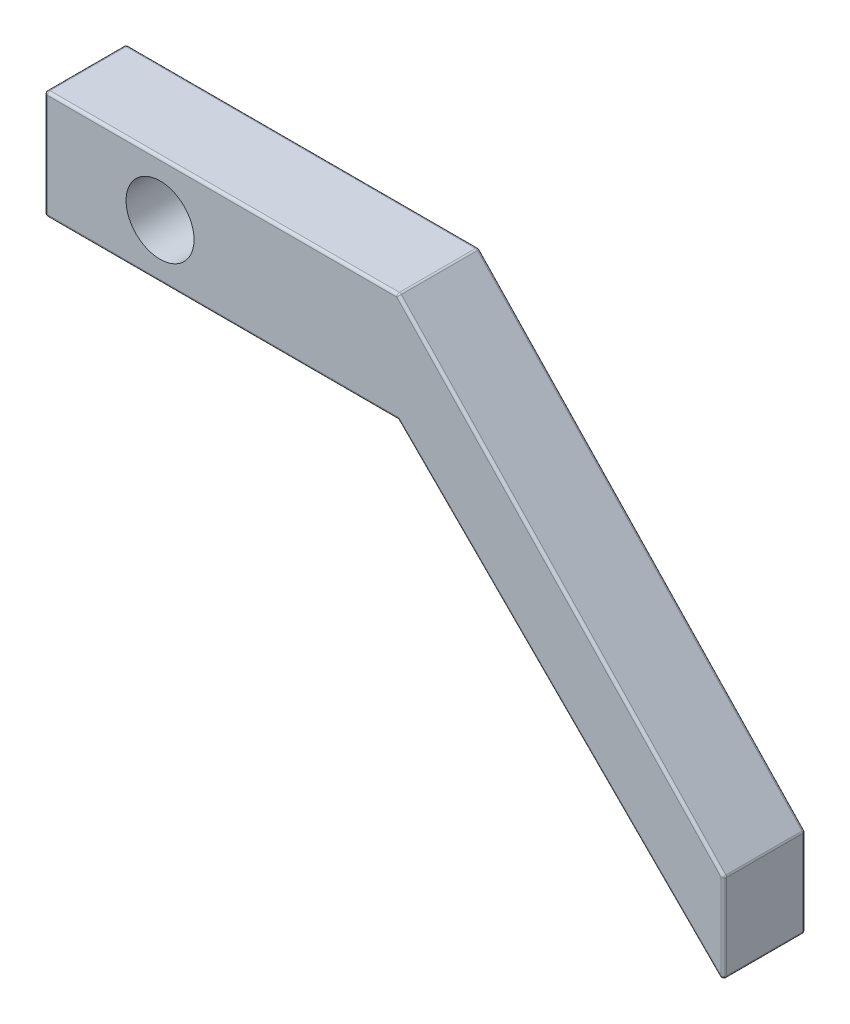
ISO-10303-21;
HEADER;
FILE_DESCRIPTION(('STEP AP214'),'2;1');
FILE_NAME('part.step','',(''),(''),'','','');
FILE_SCHEMA(('AUTOMOTIVE_DESIGN { 1 0 10303 214 1 1 1 1 }'));
ENDSEC;
DATA;
#1=APPLICATION_CONTEXT('core data for automotive mechanical design processes');
#2=APPLICATION_PROTOCOL_DEFINITION('international standard','automotive_design',2000,#1);
#3=PRODUCT_CONTEXT('',#1,'mechanical');
#4=PRODUCT('Part','Part','',(#3));
#5=PRODUCT_RELATED_PRODUCT_CATEGORY('part','',(#4));
#6=PRODUCT_DEFINITION_FORMATION('','',#4);
#7=PRODUCT_DEFINITION_CONTEXT('part definition',#1,'design');
#8=PRODUCT_DEFINITION('design','',#6,#7);
#9=PRODUCT_DEFINITION_SHAPE('','',#8);
#10=(LENGTH_UNIT() NAMED_UNIT(*) SI_UNIT(.MILLI.,.METRE.));
#11=(NAMED_UNIT(*) PLANE_ANGLE_UNIT() SI_UNIT($,.RADIAN.));
#12=(NAMED_UNIT(*) SI_UNIT($,.STERADIAN.) SOLID_ANGLE_UNIT());
#13=UNCERTAINTY_MEASURE_WITH_UNIT(LENGTH_MEASURE(1.E-05),#10,'distance_accuracy_value','');
#14=(GEOMETRIC_REPRESENTATION_CONTEXT(3) GLOBAL_UNCERTAINTY_ASSIGNED_CONTEXT((#13)) GLOBAL_UNIT_ASSIGNED_CONTEXT((#10,
#11,#12)) REPRESENTATION_CONTEXT('',''));
#15=CARTESIAN_POINT('',(0.,0.,0.));
#16=DIRECTION('',(0.,0.,1.));
#17=DIRECTION('',(1.,0.,0.));
#18=AXIS2_PLACEMENT_3D('',#15,#16,#17);
#19=CARTESIAN_POINT('',(0.,-20.,40.));
#20=DIRECTION('',(0.,1.,0.));
#21=DIRECTION('',(0.,0.,1.));
#22=AXIS2_PLACEMENT_3D('',#19,#20,#21);
#23=PLANE('',#22);
#24=DIRECTION('',(0.,0.,-1.));
#25=VECTOR('',#24,1.);
#26=CARTESIAN_POINT('',(80.,-20.,40.));
#27=LINE('',#26,#25);
#28=CARTESIAN_POINT('',(80.,-20.,29.));
#29=VERTEX_POINT('',#28);
#30=CARTESIAN_POINT('',(80.,-20.,1.));
#31=VERTEX_POINT('',#30);
#32=EDGE_CURVE('E195',#29,#31,#27,.T.);
#33=ORIENTED_EDGE('',*,*,#32,.F.);
#34=DIRECTION('',(1.,0.,0.));
#35=VECTOR('',#34,1.);
#36=CARTESIAN_POINT('',(-50.,-20.,29.));
#37=LINE('',#36,#35);
#38=CARTESIAN_POINT('',(-49.,-20.,29.));
#39=VERTEX_POINT('',#38);
#40=EDGE_CURVE('E267',#29,#39,#37,.F.);
#41=ORIENTED_EDGE('',*,*,#40,.T.);
#42=DIRECTION('',(0.,0.,1.));
#43=VECTOR('',#42,1.);
#44=CARTESIAN_POINT('',(-49.,-20.,40.));
#45=LINE('',#44,#43);
#46=CARTESIAN_POINT('',(-49.,-20.,1.));
#47=VERTEX_POINT('',#46);
#48=EDGE_CURVE('E265',#39,#47,#45,.F.);
#49=ORIENTED_EDGE('',*,*,#48,.T.);
#50=DIRECTION('',(1.,0.,0.));
#51=VECTOR('',#50,1.);
#52=CARTESIAN_POINT('',(0.,-20.,1.));
#53=LINE('',#52,#51);
#54=EDGE_CURVE('E263',#47,#31,#53,.T.);
#55=ORIENTED_EDGE('',*,*,#54,.T.);
#56=EDGE_LOOP('',(#33,#41,#49,#55));
#57=FACE_BOUND('',#56,.T.);
#58=ADVANCED_FACE('F43',(#57),#23,.F.);
#59=CARTESIAN_POINT('',(30.,30.,40.));
#60=DIRECTION('',(0.707106781186548,0.707106781186548,0.));
#61=DIRECTION('',(-0.707106781186548,0.707106781186548,0.));
#62=AXIS2_PLACEMENT_3D('',#59,#60,#61);
#63=PLANE('',#62);
#64=DIRECTION('',(0.707106781186548,-0.707106781186548,0.));
#65=VECTOR('',#64,1.);
#66=CARTESIAN_POINT('',(30.,30.,1.));
#67=LINE('',#66,#65);
#68=CARTESIAN_POINT('',(198.292893218814,-138.292893218814,1.));
#69=VERTEX_POINT('',#68);
#70=EDGE_CURVE('E202',#31,#69,#67,.T.);
#71=ORIENTED_EDGE('',*,*,#70,.T.);
#72=DIRECTION('',(0.,0.,-1.));
#73=VECTOR('',#72,1.);
#74=CARTESIAN_POINT('',(198.292893218813,-138.292893218813,29.));
#75=LINE('',#74,#73);
#76=CARTESIAN_POINT('',(198.292893218813,-138.292893218813,29.));
#77=VERTEX_POINT('',#76);
#78=EDGE_CURVE('E291',#69,#77,#75,.F.);
#79=ORIENTED_EDGE('',*,*,#78,.T.);
#80=DIRECTION('',(0.707106781186548,-0.707106781186548,0.));
#81=VECTOR('',#80,1.);
#82=CARTESIAN_POINT('',(80.,-20.,29.));
#83=LINE('',#82,#81);
#84=EDGE_CURVE('E183',#77,#29,#83,.F.);
#85=ORIENTED_EDGE('',*,*,#84,.T.);
#86=ORIENTED_EDGE('',*,*,#32,.T.);
#87=EDGE_LOOP('',(#71,#79,#85,#86));
#88=FACE_BOUND('',#87,.T.);
#89=ADVANCED_FACE('F420',(#88),#63,.F.);
#90=CARTESIAN_POINT('',(200.,0.,40.));
#91=DIRECTION('',(1.,0.,0.));
#92=DIRECTION('',(0.,0.,-1.));
#93=AXIS2_PLACEMENT_3D('',#90,#91,#92);
#94=PLANE('',#93);
#95=DIRECTION('',(0.,-1.,0.));
#96=VECTOR('',#95,1.);
#97=CARTESIAN_POINT('',(200.,0.,29.));
#98=LINE('',#97,#96);
#99=CARTESIAN_POINT('',(200.,-106.267590702867,29.));
#100=VERTEX_POINT('',#99);
#101=CARTESIAN_POINT('',(200.,-137.585786437627,29.));
#102=VERTEX_POINT('',#101);
#103=EDGE_CURVE('E227',#100,#102,#98,.T.);
#104=ORIENTED_EDGE('',*,*,#103,.T.);
#105=DIRECTION('',(0.,0.,-1.));
#106=VECTOR('',#105,1.);
#107=CARTESIAN_POINT('',(200.,-137.585786437627,1.));
#108=LINE('',#107,#106);
#109=CARTESIAN_POINT('',(200.,-137.585786437627,1.));
#110=VERTEX_POINT('',#109);
#111=EDGE_CURVE('E289',#102,#110,#108,.T.);
#112=ORIENTED_EDGE('',*,*,#111,.T.);
#113=DIRECTION('',(0.,-1.,0.));
#114=VECTOR('',#113,1.);
#115=CARTESIAN_POINT('',(200.,-105.867285411143,1.));
#116=LINE('',#115,#114);
#117=CARTESIAN_POINT('',(200.,-106.267590702867,1.));
#118=VERTEX_POINT('',#117);
#119=EDGE_CURVE('E223',#110,#118,#116,.F.);
#120=ORIENTED_EDGE('',*,*,#119,.T.);
#121=DIRECTION('',(0.,0.,-1.));
#122=VECTOR('',#121,1.);
#123=CARTESIAN_POINT('',(200.,-106.267590702867,40.));
#124=LINE('',#123,#122);
#125=EDGE_CURVE('E225',#118,#100,#124,.F.);
#126=ORIENTED_EDGE('',*,*,#125,.T.);
#127=EDGE_LOOP('',(#104,#112,#120,#126));
#128=FACE_BOUND('',#127,.T.);
#129=ADVANCED_FACE('F406',(#128),#94,.T.);
#130=CARTESIAN_POINT('',(51.8966207032648,49.4774671913315,40.));
#131=DIRECTION('',(0.723774858603321,0.690036197640198,0.));
#132=DIRECTION('',(-0.690036197640198,0.723774858603321,0.));
#133=AXIS2_PLACEMENT_3D('',#130,#131,#132);
#134=PLANE('',#133);
#135=DIRECTION('',(0.690036197640198,-0.723774858603321,0.));
#136=VECTOR('',#135,1.);
#137=CARTESIAN_POINT('',(80.,20.,1.));
#138=LINE('',#137,#136);
#139=CARTESIAN_POINT('',(199.723774858603,-105.577554505227,1.));
#140=VERTEX_POINT('',#139);
#141=CARTESIAN_POINT('',(80.2955148842821,19.6900361976402,1.));
#142=VERTEX_POINT('',#141);
#143=EDGE_CURVE('E216',#140,#142,#138,.F.);
#144=ORIENTED_EDGE('',*,*,#143,.T.);
#145=DIRECTION('',(0.,0.,-1.));
#146=VECTOR('',#145,1.);
#147=CARTESIAN_POINT('',(80.2955148842821,19.6900361976402,40.));
#148=LINE('',#147,#146);
#149=CARTESIAN_POINT('',(80.2955148842821,19.6900361976402,29.));
#150=VERTEX_POINT('',#149);
#151=EDGE_CURVE('E287',#142,#150,#148,.F.);
#152=ORIENTED_EDGE('',*,*,#151,.T.);
#153=DIRECTION('',(0.690036197640198,-0.723774858603321,0.));
#154=VECTOR('',#153,1.);
#155=CARTESIAN_POINT('',(51.8966207032648,49.4774671913315,29.));
#156=LINE('',#155,#154);
#157=CARTESIAN_POINT('',(199.723774858603,-105.577554505227,29.));
#158=VERTEX_POINT('',#157);
#159=EDGE_CURVE('E221',#150,#158,#156,.T.);
#160=ORIENTED_EDGE('',*,*,#159,.T.);
#161=DIRECTION('',(0.,0.,-1.));
#162=VECTOR('',#161,1.);
#163=CARTESIAN_POINT('',(199.723774858603,-105.577554505227,40.));
#164=LINE('',#163,#162);
#165=EDGE_CURVE('E219',#158,#140,#164,.T.);
#166=ORIENTED_EDGE('',*,*,#165,.T.);
#167=EDGE_LOOP('',(#144,#152,#160,#166));
#168=FACE_BOUND('',#167,.T.);
#169=ADVANCED_FACE('F391',(#168),#134,.T.);
#170=CARTESIAN_POINT('',(0.,20.,40.));
#171=DIRECTION('',(0.,1.,0.));
#172=DIRECTION('',(0.,0.,1.));
#173=AXIS2_PLACEMENT_3D('',#170,#171,#172);
#174=PLANE('',#173);
#175=DIRECTION('',(0.,0.,1.));
#176=VECTOR('',#175,1.);
#177=CARTESIAN_POINT('',(-49.,20.,30.));
#178=LINE('',#177,#176);
#179=CARTESIAN_POINT('',(-49.,20.,1.));
#180=VERTEX_POINT('',#179);
#181=CARTESIAN_POINT('',(-49.,20.,29.));
#182=VERTEX_POINT('',#181);
#183=EDGE_CURVE('E284',#180,#182,#178,.T.);
#184=ORIENTED_EDGE('',*,*,#183,.T.);
#185=DIRECTION('',(1.,0.,0.));
#186=VECTOR('',#185,1.);
#187=CARTESIAN_POINT('',(0.,20.,29.));
#188=LINE('',#187,#186);
#189=CARTESIAN_POINT('',(79.5717400256788,20.,29.));
#190=VERTEX_POINT('',#189);
#191=EDGE_CURVE('E60',#182,#190,#188,.T.);
#192=ORIENTED_EDGE('',*,*,#191,.T.);
#193=DIRECTION('',(0.,0.,-1.));
#194=VECTOR('',#193,1.);
#195=CARTESIAN_POINT('',(79.5717400256788,20.,40.));
#196=LINE('',#195,#194);
#197=CARTESIAN_POINT('',(79.5717400256788,20.,1.));
#198=VERTEX_POINT('',#197);
#199=EDGE_CURVE('E282',#190,#198,#196,.T.);
#200=ORIENTED_EDGE('',*,*,#199,.T.);
#201=DIRECTION('',(1.,0.,0.));
#202=VECTOR('',#201,1.);
#203=CARTESIAN_POINT('',(-50.,20.,1.));
#204=LINE('',#203,#202);
#205=EDGE_CURVE('E280',#198,#180,#204,.F.);
#206=ORIENTED_EDGE('',*,*,#205,.T.);
#207=EDGE_LOOP('',(#184,#192,#200,#206));
#208=FACE_BOUND('',#207,.T.);
#209=ADVANCED_FACE('F711',(#208),#174,.T.);
#210=CARTESIAN_POINT('',(0.,0.,0.));
#211=DIRECTION('',(0.,0.,1.));
#212=DIRECTION('',(1.,0.,0.));
#213=AXIS2_PLACEMENT_3D('',#210,#211,#212);
#214=PLANE('',#213);
#215=CARTESIAN_POINT('',(-7.5,0.,0.));
#216=DIRECTION('',(0.,0.,1.));
#217=DIRECTION('',(1.,0.,0.));
#218=AXIS2_PLACEMENT_3D('',#215,#216,#217);
#219=CIRCLE('',#218,12.5);
#220=CARTESIAN_POINT('',(5.,0.,0.));
#221=VERTEX_POINT('',#220);
#222=EDGE_CURVE('E247',#221,#221,#219,.T.);
#223=ORIENTED_EDGE('',*,*,#222,.T.);
#224=EDGE_LOOP('',(#223));
#225=FACE_BOUND('',#224,.T.);
#226=DIRECTION('',(0.,1.,0.));
#227=VECTOR('',#226,1.);
#228=CARTESIAN_POINT('',(-49.,0.,0.));
#229=LINE('',#228,#227);
#230=CARTESIAN_POINT('',(-49.,-19.,0.));
#231=VERTEX_POINT('',#230);
#232=CARTESIAN_POINT('',(-49.,19.,0.));
#233=VERTEX_POINT('',#232);
#234=EDGE_CURVE('E271',#231,#233,#229,.T.);
#235=ORIENTED_EDGE('',*,*,#234,.T.);
#236=DIRECTION('',(1.,0.,0.));
#237=VECTOR('',#236,1.);
#238=CARTESIAN_POINT('',(78.6183548818901,19.,0.));
#239=LINE('',#238,#237);
#240=CARTESIAN_POINT('',(79.5717400256788,19.,0.));
#241=VERTEX_POINT('',#240);
#242=EDGE_CURVE('E273',#233,#241,#239,.T.);
#243=ORIENTED_EDGE('',*,*,#242,.T.);
#244=DIRECTION('',(0.690036197640198,-0.723774858603321,0.));
#245=VECTOR('',#244,1.);
#246=CARTESIAN_POINT('',(199.276225141397,-106.557321608783,0.));
#247=LINE('',#246,#245);
#248=CARTESIAN_POINT('',(199.,-106.267590702867,0.));
#249=VERTEX_POINT('',#248);
#250=EDGE_CURVE('E209',#241,#249,#247,.T.);
#251=ORIENTED_EDGE('',*,*,#250,.T.);
#252=DIRECTION('',(0.,-1.,0.));
#253=VECTOR('',#252,1.);
#254=CARTESIAN_POINT('',(199.,-140.,0.));
#255=LINE('',#254,#253);
#256=CARTESIAN_POINT('',(199.,-137.585786437627,0.));
#257=VERTEX_POINT('',#256);
#258=EDGE_CURVE('E211',#249,#257,#255,.T.);
#259=ORIENTED_EDGE('',*,*,#258,.T.);
#260=DIRECTION('',(0.707106781186548,-0.707106781186548,0.));
#261=VECTOR('',#260,1.);
#262=CARTESIAN_POINT('',(30.7071067811865,30.7071067811865,0.));
#263=LINE('',#262,#261);
#264=CARTESIAN_POINT('',(80.4142135623731,-19.,0.));
#265=VERTEX_POINT('',#264);
#266=EDGE_CURVE('E214',#257,#265,#263,.F.);
#267=ORIENTED_EDGE('',*,*,#266,.T.);
#268=DIRECTION('',(1.,0.,0.));
#269=VECTOR('',#268,1.);
#270=CARTESIAN_POINT('',(0.,-19.,0.));
#271=LINE('',#270,#269);
#272=EDGE_CURVE('E269',#265,#231,#271,.F.);
#273=ORIENTED_EDGE('',*,*,#272,.T.);
#274=EDGE_LOOP('',(#235,#243,#251,#259,#267,#273));
#275=FACE_BOUND('',#274,.T.);
#276=ADVANCED_FACE('F355',(#225,#275),#214,.F.);
#277=CARTESIAN_POINT('',(0.,0.,30.));
#278=DIRECTION('',(0.,0.,1.));
#279=DIRECTION('',(1.,0.,0.));
#280=AXIS2_PLACEMENT_3D('',#277,#278,#279);
#281=PLANE('',#280);
#282=DIRECTION('',(0.690036197640198,-0.723774858603321,0.));
#283=VECTOR('',#282,1.);
#284=CARTESIAN_POINT('',(51.1728458446615,48.7874309936913,30.));
#285=LINE('',#284,#283);
#286=CARTESIAN_POINT('',(199.,-106.267590702867,30.));
#287=VERTEX_POINT('',#286);
#288=CARTESIAN_POINT('',(79.5717400256788,19.,30.));
#289=VERTEX_POINT('',#288);
#290=EDGE_CURVE('E194',#287,#289,#285,.F.);
#291=ORIENTED_EDGE('',*,*,#290,.T.);
#292=DIRECTION('',(1.,0.,0.));
#293=VECTOR('',#292,1.);
#294=CARTESIAN_POINT('',(0.,19.,30.));
#295=LINE('',#294,#293);
#296=CARTESIAN_POINT('',(-49.,19.,30.));
#297=VERTEX_POINT('',#296);
#298=EDGE_CURVE('E278',#289,#297,#295,.F.);
#299=ORIENTED_EDGE('',*,*,#298,.T.);
#300=DIRECTION('',(0.,1.,0.));
#301=VECTOR('',#300,1.);
#302=CARTESIAN_POINT('',(-49.,-20.,30.));
#303=LINE('',#302,#301);
#304=CARTESIAN_POINT('',(-49.,-19.,30.));
#305=VERTEX_POINT('',#304);
#306=EDGE_CURVE('E276',#297,#305,#303,.F.);
#307=ORIENTED_EDGE('',*,*,#306,.T.);
#308=DIRECTION('',(1.,0.,0.));
#309=VECTOR('',#308,1.);
#310=CARTESIAN_POINT('',(81.4142135623731,-19.,30.));
#311=LINE('',#310,#309);
#312=CARTESIAN_POINT('',(80.4142135623731,-19.,30.));
#313=VERTEX_POINT('',#312);
#314=EDGE_CURVE('E200',#305,#313,#311,.T.);
#315=ORIENTED_EDGE('',*,*,#314,.T.);
#316=DIRECTION('',(0.707106781186548,-0.707106781186548,0.));
#317=VECTOR('',#316,1.);
#318=CARTESIAN_POINT('',(200.707106781187,-139.292893218814,30.));
#319=LINE('',#318,#317);
#320=CARTESIAN_POINT('',(199.,-137.585786437627,30.));
#321=VERTEX_POINT('',#320);
#322=EDGE_CURVE('E180',#313,#321,#319,.T.);
#323=ORIENTED_EDGE('',*,*,#322,.T.);
#324=DIRECTION('',(0.,-1.,0.));
#325=VECTOR('',#324,1.);
#326=CARTESIAN_POINT('',(199.,0.,30.));
#327=LINE('',#326,#325);
#328=EDGE_CURVE('E187',#321,#287,#327,.F.);
#329=ORIENTED_EDGE('',*,*,#328,.T.);
#330=EDGE_LOOP('',(#291,#299,#307,#315,#323,#329));
#331=FACE_BOUND('',#330,.T.);
#332=CARTESIAN_POINT('',(-7.5,0.,30.));
#333=DIRECTION('',(0.,0.,1.));
#334=DIRECTION('',(1.,0.,0.));
#335=AXIS2_PLACEMENT_3D('',#332,#333,#334);
#336=CIRCLE('',#335,12.5);
#337=CARTESIAN_POINT('',(5.,0.,30.));
#338=VERTEX_POINT('',#337);
#339=EDGE_CURVE('E750',#338,#338,#336,.T.);
#340=ORIENTED_EDGE('',*,*,#339,.F.);
#341=EDGE_LOOP('',(#340));
#342=FACE_BOUND('',#341,.T.);
#343=ADVANCED_FACE('F197',(#331,#342),#281,.T.);
#344=CARTESIAN_POINT('',(-7.5,0.,0.));
#345=DIRECTION('',(0.,0.,1.));
#346=DIRECTION('',(1.,0.,0.));
#347=AXIS2_PLACEMENT_3D('',#344,#345,#346);
#348=CYLINDRICAL_SURFACE('',#347,12.5);
#349=ORIENTED_EDGE('',*,*,#339,.T.);
#350=EDGE_LOOP('',(#349));
#351=FACE_BOUND('',#350,.T.);
#352=ORIENTED_EDGE('',*,*,#222,.F.);
#353=EDGE_LOOP('',(#352));
#354=FACE_BOUND('',#353,.T.);
#355=ADVANCED_FACE('F667',(#351,#354),#348,.F.);
#356=CARTESIAN_POINT('',(-50.,20.,0.));
#357=DIRECTION('',(1.,0.,0.));
#358=DIRECTION('',(0.,0.,-1.));
#359=AXIS2_PLACEMENT_3D('',#356,#357,#358);
#360=PLANE('',#359);
#361=DIRECTION('',(0.,1.,0.));
#362=VECTOR('',#361,1.);
#363=CARTESIAN_POINT('',(-50.,20.,1.));
#364=LINE('',#363,#362);
#365=CARTESIAN_POINT('',(-50.,19.,1.));
#366=VERTEX_POINT('',#365);
#367=CARTESIAN_POINT('',(-50.,-19.,1.));
#368=VERTEX_POINT('',#367);
#369=EDGE_CURVE('E258',#366,#368,#364,.F.);
#370=ORIENTED_EDGE('',*,*,#369,.T.);
#371=DIRECTION('',(0.,0.,1.));
#372=VECTOR('',#371,1.);
#373=CARTESIAN_POINT('',(-50.,-19.,0.));
#374=LINE('',#373,#372);
#375=CARTESIAN_POINT('',(-50.,-19.,29.));
#376=VERTEX_POINT('',#375);
#377=EDGE_CURVE('E260',#368,#376,#374,.T.);
#378=ORIENTED_EDGE('',*,*,#377,.T.);
#379=DIRECTION('',(0.,1.,0.));
#380=VECTOR('',#379,1.);
#381=CARTESIAN_POINT('',(-50.,20.,29.));
#382=LINE('',#381,#380);
#383=CARTESIAN_POINT('',(-50.,19.,29.));
#384=VERTEX_POINT('',#383);
#385=EDGE_CURVE('E256',#376,#384,#382,.T.);
#386=ORIENTED_EDGE('',*,*,#385,.T.);
#387=DIRECTION('',(0.,0.,1.));
#388=VECTOR('',#387,1.);
#389=CARTESIAN_POINT('',(-50.,19.,0.));
#390=LINE('',#389,#388);
#391=EDGE_CURVE('E254',#384,#366,#390,.F.);
#392=ORIENTED_EDGE('',*,*,#391,.T.);
#393=EDGE_LOOP('',(#370,#378,#386,#392));
#394=FACE_BOUND('',#393,.T.);
#395=ADVANCED_FACE('F633',(#394),#360,.F.);
#396=CARTESIAN_POINT('',(30.7071067811865,30.7071067811865,1.));
#397=DIRECTION('',(0.707106781186548,-0.707106781186548,0.));
#398=DIRECTION('',(0.707106781186548,0.707106781186548,0.));
#399=AXIS2_PLACEMENT_3D('',#396,#397,#398);
#400=CYLINDRICAL_SURFACE('',#399,1.);
#401=ORIENTED_EDGE('',*,*,#266,.F.);
#402=CARTESIAN_POINT('',(199.,-137.585786437627,1.));
#403=DIRECTION('',(0.707106781186548,-0.707106781186548,0.));
#404=DIRECTION('',(0.707106781186548,0.707106781186548,0.));
#405=AXIS2_PLACEMENT_3D('',#402,#403,#404);
#406=CIRCLE('',#405,1.);
#407=EDGE_CURVE('E252',#257,#69,#406,.F.);
#408=ORIENTED_EDGE('',*,*,#407,.T.);
#409=ORIENTED_EDGE('',*,*,#70,.F.);
#410=CARTESIAN_POINT('',(80.4142135623731,-19.,1.));
#411=DIRECTION('',(0.923879532511287,-0.38268343236509,0.));
#412=DIRECTION('',(0.38268343236509,0.923879532511287,0.));
#413=AXIS2_PLACEMENT_3D('',#410,#411,#412);
#414=ELLIPSE('',#413,1.08239220029239,1.);
#415=EDGE_CURVE('E11',#31,#265,#414,.T.);
#416=ORIENTED_EDGE('',*,*,#415,.T.);
#417=EDGE_LOOP('',(#401,#408,#409,#416));
#418=FACE_BOUND('',#417,.T.);
#419=ADVANCED_FACE('F358',(#418),#400,.T.);
#420=CARTESIAN_POINT('',(51.1728458446615,48.7874309936913,1.));
#421=DIRECTION('',(-0.690036197640198,0.723774858603321,0.));
#422=DIRECTION('',(-0.723774858603321,-0.690036197640198,0.));
#423=AXIS2_PLACEMENT_3D('',#420,#421,#422);
#424=CYLINDRICAL_SURFACE('',#423,1.);
#425=ORIENTED_EDGE('',*,*,#250,.F.);
#426=CARTESIAN_POINT('',(79.5717400256788,19.,1.));
#427=DIRECTION('',(-0.690036197640198,0.723774858603321,0.));
#428=DIRECTION('',(-0.723774858603321,-0.690036197640198,0.));
#429=AXIS2_PLACEMENT_3D('',#426,#427,#428);
#430=CIRCLE('',#429,1.);
#431=EDGE_CURVE('E184',#241,#142,#430,.F.);
#432=ORIENTED_EDGE('',*,*,#431,.T.);
#433=ORIENTED_EDGE('',*,*,#143,.F.);
#434=CARTESIAN_POINT('',(199.,-106.267590702867,1.));
#435=DIRECTION('',(0.690036197640191,-0.723774858603328,0.));
#436=DIRECTION('',(0.723774858603328,0.690036197640191,0.));
#437=AXIS2_PLACEMENT_3D('',#434,#435,#436);
#438=CIRCLE('',#437,1.);
#439=EDGE_CURVE('E244',#249,#140,#438,.T.);
#440=ORIENTED_EDGE('',*,*,#439,.F.);
#441=EDGE_LOOP('',(#425,#432,#433,#440));
#442=FACE_BOUND('',#441,.T.);
#443=ADVANCED_FACE('F389',(#442),#424,.T.);
#444=CARTESIAN_POINT('',(199.,0.,1.));
#445=DIRECTION('',(0.,1.,0.));
#446=DIRECTION('',(0.,0.,1.));
#447=AXIS2_PLACEMENT_3D('',#444,#445,#446);
#448=CYLINDRICAL_SURFACE('',#447,1.);
#449=ORIENTED_EDGE('',*,*,#119,.F.);
#450=CARTESIAN_POINT('',(199.,-137.585786437627,1.));
#451=DIRECTION('',(0.,1.,0.));
#452=DIRECTION('',(0.,0.,1.));
#453=AXIS2_PLACEMENT_3D('',#450,#451,#452);
#454=CIRCLE('',#453,1.);
#455=EDGE_CURVE('E174',#110,#257,#454,.T.);
#456=ORIENTED_EDGE('',*,*,#455,.T.);
#457=ORIENTED_EDGE('',*,*,#258,.F.);
#458=CARTESIAN_POINT('',(199.,-106.267590702867,1.));
#459=DIRECTION('',(0.,1.,0.));
#460=DIRECTION('',(0.,0.,1.));
#461=AXIS2_PLACEMENT_3D('',#458,#459,#460);
#462=CIRCLE('',#461,1.);
#463=EDGE_CURVE('E241',#118,#249,#462,.T.);
#464=ORIENTED_EDGE('',*,*,#463,.F.);
#465=EDGE_LOOP('',(#449,#456,#457,#464));
#466=FACE_BOUND('',#465,.T.);
#467=ADVANCED_FACE('F350',(#466),#448,.T.);
#468=CARTESIAN_POINT('',(199.,-106.267590702867,1.));
#469=DIRECTION('',(0.,0.,-1.));
#470=DIRECTION('',(0.,1.,0.));
#471=AXIS2_PLACEMENT_3D('',#468,#469,#470);
#472=SPHERICAL_SURFACE('',#471,1.);
#473=ORIENTED_EDGE('',*,*,#463,.T.);
#474=ORIENTED_EDGE('',*,*,#439,.T.);
#475=CARTESIAN_POINT('',(199.,-106.267590702867,1.));
#476=DIRECTION('',(0.,0.,-1.));
#477=DIRECTION('',(-1.,0.,0.));
#478=AXIS2_PLACEMENT_3D('',#475,#476,#477);
#479=CIRCLE('',#478,1.);
#480=EDGE_CURVE('E238',#118,#140,#479,.F.);
#481=ORIENTED_EDGE('',*,*,#480,.F.);
#482=EDGE_LOOP('',(#473,#474,#481));
#483=FACE_BOUND('',#482,.T.);
#484=ADVANCED_FACE('F408',(#483),#472,.T.);
#485=CARTESIAN_POINT('',(51.1728458446615,48.7874309936913,29.));
#486=DIRECTION('',(0.690036197640198,-0.723774858603321,0.));
#487=DIRECTION('',(0.723774858603321,0.690036197640198,0.));
#488=AXIS2_PLACEMENT_3D('',#485,#486,#487);
#489=CYLINDRICAL_SURFACE('',#488,1.);
#490=ORIENTED_EDGE('',*,*,#159,.F.);
#491=CARTESIAN_POINT('',(79.5717400256788,19.,29.));
#492=DIRECTION('',(0.690036197640198,-0.723774858603321,0.));
#493=DIRECTION('',(0.723774858603321,0.690036197640198,0.));
#494=AXIS2_PLACEMENT_3D('',#491,#492,#493);
#495=CIRCLE('',#494,1.);
#496=EDGE_CURVE('E229',#150,#289,#495,.T.);
#497=ORIENTED_EDGE('',*,*,#496,.T.);
#498=ORIENTED_EDGE('',*,*,#290,.F.);
#499=CARTESIAN_POINT('',(199.,-106.267590702867,29.));
#500=DIRECTION('',(0.690036197640205,-0.723774858603314,0.));
#501=DIRECTION('',(0.723774858603314,0.690036197640205,0.));
#502=AXIS2_PLACEMENT_3D('',#499,#500,#501);
#503=CIRCLE('',#502,1.);
#504=EDGE_CURVE('E235',#158,#287,#503,.T.);
#505=ORIENTED_EDGE('',*,*,#504,.F.);
#506=EDGE_LOOP('',(#490,#497,#498,#505));
#507=FACE_BOUND('',#506,.T.);
#508=ADVANCED_FACE('F401',(#507),#489,.T.);
#509=CARTESIAN_POINT('',(199.,-106.267590702867,40.));
#510=DIRECTION('',(0.,0.,-1.));
#511=DIRECTION('',(-1.,0.,0.));
#512=AXIS2_PLACEMENT_3D('',#509,#510,#511);
#513=CYLINDRICAL_SURFACE('',#512,1.);
#514=ORIENTED_EDGE('',*,*,#480,.T.);
#515=ORIENTED_EDGE('',*,*,#165,.F.);
#516=CARTESIAN_POINT('',(199.,-106.267590702867,29.));
#517=DIRECTION('',(0.,0.,1.));
#518=DIRECTION('',(1.,0.,0.));
#519=AXIS2_PLACEMENT_3D('',#516,#517,#518);
#520=CIRCLE('',#519,1.);
#521=EDGE_CURVE('E231',#100,#158,#520,.T.);
#522=ORIENTED_EDGE('',*,*,#521,.F.);
#523=ORIENTED_EDGE('',*,*,#125,.F.);
#524=EDGE_LOOP('',(#514,#515,#522,#523));
#525=FACE_BOUND('',#524,.T.);
#526=ADVANCED_FACE('F397',(#525),#513,.T.);
#527=CARTESIAN_POINT('',(199.,-106.267590702867,29.));
#528=DIRECTION('',(0.,0.,1.));
#529=DIRECTION('',(0.,-1.,0.));
#530=AXIS2_PLACEMENT_3D('',#527,#528,#529);
#531=SPHERICAL_SURFACE('',#530,1.);
#532=ORIENTED_EDGE('',*,*,#521,.T.);
#533=ORIENTED_EDGE('',*,*,#504,.T.);
#534=CARTESIAN_POINT('',(199.,-106.267590702867,29.));
#535=DIRECTION('',(0.,1.,0.));
#536=DIRECTION('',(-1.,0.,0.));
#537=AXIS2_PLACEMENT_3D('',#534,#535,#536);
#538=CIRCLE('',#537,1.);
#539=EDGE_CURVE('E190',#100,#287,#538,.F.);
#540=ORIENTED_EDGE('',*,*,#539,.F.);
#541=EDGE_LOOP('',(#532,#533,#540));
#542=FACE_BOUND('',#541,.T.);
#543=ADVANCED_FACE('F404',(#542),#531,.T.);
#544=CARTESIAN_POINT('',(199.,0.,29.));
#545=DIRECTION('',(0.,-1.,0.));
#546=DIRECTION('',(0.,0.,-1.));
#547=AXIS2_PLACEMENT_3D('',#544,#545,#546);
#548=CYLINDRICAL_SURFACE('',#547,1.);
#549=ORIENTED_EDGE('',*,*,#328,.F.);
#550=CARTESIAN_POINT('',(199.,-137.585786437627,29.));
#551=DIRECTION('',(0.,-1.,0.));
#552=DIRECTION('',(0.,0.,-1.));
#553=AXIS2_PLACEMENT_3D('',#550,#551,#552);
#554=CIRCLE('',#553,1.);
#555=EDGE_CURVE('E164',#321,#102,#554,.F.);
#556=ORIENTED_EDGE('',*,*,#555,.T.);
#557=ORIENTED_EDGE('',*,*,#103,.F.);
#558=ORIENTED_EDGE('',*,*,#539,.T.);
#559=EDGE_LOOP('',(#549,#556,#557,#558));
#560=FACE_BOUND('',#559,.T.);
#561=ADVANCED_FACE('F188',(#560),#548,.T.);
#562=CARTESIAN_POINT('',(30.7071067811865,30.7071067811865,29.));
#563=DIRECTION('',(-0.707106781186548,0.707106781186548,0.));
#564=DIRECTION('',(-0.707106781186548,-0.707106781186548,0.));
#565=AXIS2_PLACEMENT_3D('',#562,#563,#564);
#566=CYLINDRICAL_SURFACE('',#565,1.);
#567=ORIENTED_EDGE('',*,*,#84,.F.);
#568=CARTESIAN_POINT('',(199.,-137.585786437627,29.));
#569=DIRECTION('',(-0.707106781186548,0.707106781186548,0.));
#570=DIRECTION('',(-0.707106781186548,-0.707106781186548,0.));
#571=AXIS2_PLACEMENT_3D('',#568,#569,#570);
#572=CIRCLE('',#571,1.);
#573=EDGE_CURVE('E167',#77,#321,#572,.T.);
#574=ORIENTED_EDGE('',*,*,#573,.T.);
#575=ORIENTED_EDGE('',*,*,#322,.F.);
#576=CARTESIAN_POINT('',(80.4142135623731,-19.,29.));
#577=DIRECTION('',(-0.923879532511287,0.38268343236509,0.));
#578=DIRECTION('',(-0.38268343236509,-0.923879532511287,0.));
#579=AXIS2_PLACEMENT_3D('',#576,#577,#578);
#580=ELLIPSE('',#579,1.08239220029239,1.);
#581=EDGE_CURVE('E52',#313,#29,#580,.F.);
#582=ORIENTED_EDGE('',*,*,#581,.T.);
#583=EDGE_LOOP('',(#567,#574,#575,#582));
#584=FACE_BOUND('',#583,.T.);
#585=ADVANCED_FACE('F178',(#584),#566,.T.);
#586=CARTESIAN_POINT('',(0.,-19.,1.));
#587=DIRECTION('',(1.,0.,0.));
#588=DIRECTION('',(0.,0.,-1.));
#589=AXIS2_PLACEMENT_3D('',#586,#587,#588);
#590=CYLINDRICAL_SURFACE('',#589,1.);
#591=CARTESIAN_POINT('',(-49.,-19.,1.));
#592=DIRECTION('',(-1.,0.,0.));
#593=DIRECTION('',(0.,0.,1.));
#594=AXIS2_PLACEMENT_3D('',#591,#592,#593);
#595=CIRCLE('',#594,1.);
#596=EDGE_CURVE('E232',#231,#47,#595,.T.);
#597=ORIENTED_EDGE('',*,*,#596,.F.);
#598=ORIENTED_EDGE('',*,*,#272,.F.);
#599=ORIENTED_EDGE('',*,*,#415,.F.);
#600=ORIENTED_EDGE('',*,*,#54,.F.);
#601=EDGE_LOOP('',(#597,#598,#599,#600));
#602=FACE_BOUND('',#601,.T.);
#603=ADVANCED_FACE('F365',(#602),#590,.T.);
#604=CARTESIAN_POINT('',(-49.,-19.,1.));
#605=DIRECTION('',(0.,-1.,0.));
#606=DIRECTION('',(0.,0.,-1.));
#607=AXIS2_PLACEMENT_3D('',#604,#605,#606);
#608=SPHERICAL_SURFACE('',#607,1.);
#609=CARTESIAN_POINT('',(-49.,-19.,1.));
#610=DIRECTION('',(0.,-1.,0.));
#611=DIRECTION('',(0.,0.,-1.));
#612=AXIS2_PLACEMENT_3D('',#609,#610,#611);
#613=CIRCLE('',#612,1.);
#614=EDGE_CURVE('E331',#231,#368,#613,.F.);
#615=ORIENTED_EDGE('',*,*,#614,.F.);
#616=ORIENTED_EDGE('',*,*,#596,.T.);
#617=CARTESIAN_POINT('',(-49.,-19.,1.));
#618=DIRECTION('',(0.,0.,-1.));
#619=DIRECTION('',(-1.,0.,0.));
#620=AXIS2_PLACEMENT_3D('',#617,#618,#619);
#621=CIRCLE('',#620,1.);
#622=EDGE_CURVE('E334',#368,#47,#621,.F.);
#623=ORIENTED_EDGE('',*,*,#622,.F.);
#624=EDGE_LOOP('',(#615,#616,#623));
#625=FACE_BOUND('',#624,.T.);
#626=ADVANCED_FACE('F467',(#625),#608,.T.);
#627=CARTESIAN_POINT('',(0.,-19.,29.));
#628=DIRECTION('',(-1.,0.,0.));
#629=DIRECTION('',(0.,0.,1.));
#630=AXIS2_PLACEMENT_3D('',#627,#628,#629);
#631=CYLINDRICAL_SURFACE('',#630,1.);
#632=ORIENTED_EDGE('',*,*,#581,.F.);
#633=ORIENTED_EDGE('',*,*,#314,.F.);
#634=CARTESIAN_POINT('',(-49.,-19.,29.));
#635=DIRECTION('',(-1.,0.,0.));
#636=DIRECTION('',(0.,0.,1.));
#637=AXIS2_PLACEMENT_3D('',#634,#635,#636);
#638=CIRCLE('',#637,1.);
#639=EDGE_CURVE('E328',#39,#305,#638,.T.);
#640=ORIENTED_EDGE('',*,*,#639,.F.);
#641=ORIENTED_EDGE('',*,*,#40,.F.);
#642=EDGE_LOOP('',(#632,#633,#640,#641));
#643=FACE_BOUND('',#642,.T.);
#644=ADVANCED_FACE('F476',(#643),#631,.T.);
#645=CARTESIAN_POINT('',(-49.,-19.,0.));
#646=DIRECTION('',(0.,0.,1.));
#647=DIRECTION('',(1.,0.,0.));
#648=AXIS2_PLACEMENT_3D('',#645,#646,#647);
#649=CYLINDRICAL_SURFACE('',#648,1.);
#650=ORIENTED_EDGE('',*,*,#622,.T.);
#651=ORIENTED_EDGE('',*,*,#48,.F.);
#652=CARTESIAN_POINT('',(-49.,-19.,29.));
#653=DIRECTION('',(0.,0.,1.));
#654=DIRECTION('',(1.,0.,0.));
#655=AXIS2_PLACEMENT_3D('',#652,#653,#654);
#656=CIRCLE('',#655,1.);
#657=EDGE_CURVE('E325',#376,#39,#656,.T.);
#658=ORIENTED_EDGE('',*,*,#657,.F.);
#659=ORIENTED_EDGE('',*,*,#377,.F.);
#660=EDGE_LOOP('',(#650,#651,#658,#659));
#661=FACE_BOUND('',#660,.T.);
#662=ADVANCED_FACE('F486',(#661),#649,.T.);
#663=CARTESIAN_POINT('',(-49.,0.,1.));
#664=DIRECTION('',(0.,1.,0.));
#665=DIRECTION('',(0.,0.,1.));
#666=AXIS2_PLACEMENT_3D('',#663,#664,#665);
#667=CYLINDRICAL_SURFACE('',#666,1.);
#668=ORIENTED_EDGE('',*,*,#614,.T.);
#669=ORIENTED_EDGE('',*,*,#369,.F.);
#670=CARTESIAN_POINT('',(-49.,19.,1.));
#671=DIRECTION('',(0.,1.,0.));
#672=DIRECTION('',(0.,0.,1.));
#673=AXIS2_PLACEMENT_3D('',#670,#671,#672);
#674=CIRCLE('',#673,1.);
#675=EDGE_CURVE('E322',#233,#366,#674,.T.);
#676=ORIENTED_EDGE('',*,*,#675,.F.);
#677=ORIENTED_EDGE('',*,*,#234,.F.);
#678=EDGE_LOOP('',(#668,#669,#676,#677));
#679=FACE_BOUND('',#678,.T.);
#680=ADVANCED_FACE('F373',(#679),#667,.T.);
#681=CARTESIAN_POINT('',(-49.,-19.,29.));
#682=DIRECTION('',(0.,-1.,0.));
#683=DIRECTION('',(0.,0.,-1.));
#684=AXIS2_PLACEMENT_3D('',#681,#682,#683);
#685=SPHERICAL_SURFACE('',#684,1.);
#686=ORIENTED_EDGE('',*,*,#657,.T.);
#687=ORIENTED_EDGE('',*,*,#639,.T.);
#688=CARTESIAN_POINT('',(-49.,-19.,29.));
#689=DIRECTION('',(0.,-1.,0.));
#690=DIRECTION('',(1.,0.,0.));
#691=AXIS2_PLACEMENT_3D('',#688,#689,#690);
#692=CIRCLE('',#691,1.);
#693=EDGE_CURVE('E319',#376,#305,#692,.F.);
#694=ORIENTED_EDGE('',*,*,#693,.F.);
#695=EDGE_LOOP('',(#686,#687,#694));
#696=FACE_BOUND('',#695,.T.);
#697=ADVANCED_FACE('F505',(#696),#685,.T.);
#698=CARTESIAN_POINT('',(-49.,19.,1.));
#699=DIRECTION('',(-1.,0.,0.));
#700=DIRECTION('',(0.,0.,1.));
#701=AXIS2_PLACEMENT_3D('',#698,#699,#700);
#702=SPHERICAL_SURFACE('',#701,1.);
#703=CARTESIAN_POINT('',(-49.,19.,1.));
#704=DIRECTION('',(-1.,0.,0.));
#705=DIRECTION('',(0.,0.,1.));
#706=AXIS2_PLACEMENT_3D('',#703,#704,#705);
#707=CIRCLE('',#706,1.);
#708=EDGE_CURVE('E313',#233,#180,#707,.F.);
#709=ORIENTED_EDGE('',*,*,#708,.F.);
#710=ORIENTED_EDGE('',*,*,#675,.T.);
#711=CARTESIAN_POINT('',(-49.,19.,1.));
#712=DIRECTION('',(0.,0.,-1.));
#713=DIRECTION('',(-1.,0.,0.));
#714=AXIS2_PLACEMENT_3D('',#711,#712,#713);
#715=CIRCLE('',#714,1.);
#716=EDGE_CURVE('E316',#180,#366,#715,.F.);
#717=ORIENTED_EDGE('',*,*,#716,.F.);
#718=EDGE_LOOP('',(#709,#710,#717));
#719=FACE_BOUND('',#718,.T.);
#720=ADVANCED_FACE('F376',(#719),#702,.T.);
#721=CARTESIAN_POINT('',(-49.,20.,29.));
#722=DIRECTION('',(0.,-1.,0.));
#723=DIRECTION('',(0.,0.,-1.));
#724=AXIS2_PLACEMENT_3D('',#721,#722,#723);
#725=CYLINDRICAL_SURFACE('',#724,1.);
#726=ORIENTED_EDGE('',*,*,#693,.T.);
#727=ORIENTED_EDGE('',*,*,#306,.F.);
#728=CARTESIAN_POINT('',(-49.,19.,29.));
#729=DIRECTION('',(0.,1.,0.));
#730=DIRECTION('',(0.,0.,1.));
#731=AXIS2_PLACEMENT_3D('',#728,#729,#730);
#732=CIRCLE('',#731,1.);
#733=EDGE_CURVE('E310',#384,#297,#732,.T.);
#734=ORIENTED_EDGE('',*,*,#733,.F.);
#735=ORIENTED_EDGE('',*,*,#385,.F.);
#736=EDGE_LOOP('',(#726,#727,#734,#735));
#737=FACE_BOUND('',#736,.T.);
#738=ADVANCED_FACE('F523',(#737),#725,.T.);
#739=CARTESIAN_POINT('',(-49.,19.,40.));
#740=DIRECTION('',(0.,0.,-1.));
#741=DIRECTION('',(-1.,0.,0.));
#742=AXIS2_PLACEMENT_3D('',#739,#740,#741);
#743=CYLINDRICAL_SURFACE('',#742,1.);
#744=ORIENTED_EDGE('',*,*,#716,.T.);
#745=ORIENTED_EDGE('',*,*,#391,.F.);
#746=CARTESIAN_POINT('',(-49.,19.,29.));
#747=DIRECTION('',(0.,0.,1.));
#748=DIRECTION('',(1.,0.,0.));
#749=AXIS2_PLACEMENT_3D('',#746,#747,#748);
#750=CIRCLE('',#749,1.);
#751=EDGE_CURVE('E307',#182,#384,#750,.T.);
#752=ORIENTED_EDGE('',*,*,#751,.F.);
#753=ORIENTED_EDGE('',*,*,#183,.F.);
#754=EDGE_LOOP('',(#744,#745,#752,#753));
#755=FACE_BOUND('',#754,.T.);
#756=ADVANCED_FACE('F532',(#755),#743,.T.);
#757=CARTESIAN_POINT('',(0.,19.,1.));
#758=DIRECTION('',(-1.,0.,0.));
#759=DIRECTION('',(0.,0.,1.));
#760=AXIS2_PLACEMENT_3D('',#757,#758,#759);
#761=CYLINDRICAL_SURFACE('',#760,1.);
#762=ORIENTED_EDGE('',*,*,#708,.T.);
#763=ORIENTED_EDGE('',*,*,#205,.F.);
#764=CARTESIAN_POINT('',(79.5717400256788,19.,1.));
#765=DIRECTION('',(1.,0.,0.));
#766=DIRECTION('',(0.,1.,0.));
#767=AXIS2_PLACEMENT_3D('',#764,#765,#766);
#768=CIRCLE('',#767,1.);
#769=EDGE_CURVE('E304',#241,#198,#768,.T.);
#770=ORIENTED_EDGE('',*,*,#769,.F.);
#771=ORIENTED_EDGE('',*,*,#242,.F.);
#772=EDGE_LOOP('',(#762,#763,#770,#771));
#773=FACE_BOUND('',#772,.T.);
#774=ADVANCED_FACE('F381',(#773),#761,.T.);
#775=CARTESIAN_POINT('',(-49.,19.,29.));
#776=DIRECTION('',(-1.,0.,0.));
#777=DIRECTION('',(0.,0.,1.));
#778=AXIS2_PLACEMENT_3D('',#775,#776,#777);
#779=SPHERICAL_SURFACE('',#778,1.);
#780=ORIENTED_EDGE('',*,*,#751,.T.);
#781=ORIENTED_EDGE('',*,*,#733,.T.);
#782=CARTESIAN_POINT('',(-49.,19.,29.));
#783=DIRECTION('',(-1.,0.,0.));
#784=DIRECTION('',(0.,0.,1.));
#785=AXIS2_PLACEMENT_3D('',#782,#783,#784);
#786=CIRCLE('',#785,1.);
#787=EDGE_CURVE('E302',#182,#297,#786,.F.);
#788=ORIENTED_EDGE('',*,*,#787,.F.);
#789=EDGE_LOOP('',(#780,#781,#788));
#790=FACE_BOUND('',#789,.T.);
#791=ADVANCED_FACE('F551',(#790),#779,.T.);
#792=CARTESIAN_POINT('',(79.5717400256788,19.,1.));
#793=DIRECTION('',(0.,1.,0.));
#794=DIRECTION('',(0.,0.,1.));
#795=AXIS2_PLACEMENT_3D('',#792,#793,#794);
#796=SPHERICAL_SURFACE('',#795,1.);
#797=ORIENTED_EDGE('',*,*,#431,.F.);
#798=ORIENTED_EDGE('',*,*,#769,.T.);
#799=CARTESIAN_POINT('',(79.5717400256788,19.,1.));
#800=DIRECTION('',(0.,0.,1.));
#801=DIRECTION('',(1.,0.,0.));
#802=AXIS2_PLACEMENT_3D('',#799,#800,#801);
#803=CIRCLE('',#802,1.);
#804=EDGE_CURVE('E299',#142,#198,#803,.T.);
#805=ORIENTED_EDGE('',*,*,#804,.F.);
#806=EDGE_LOOP('',(#797,#798,#805));
#807=FACE_BOUND('',#806,.T.);
#808=ADVANCED_FACE('F385',(#807),#796,.T.);
#809=CARTESIAN_POINT('',(0.,19.,29.));
#810=DIRECTION('',(1.,0.,0.));
#811=DIRECTION('',(0.,0.,-1.));
#812=AXIS2_PLACEMENT_3D('',#809,#810,#811);
#813=CYLINDRICAL_SURFACE('',#812,1.);
#814=ORIENTED_EDGE('',*,*,#787,.T.);
#815=ORIENTED_EDGE('',*,*,#298,.F.);
#816=CARTESIAN_POINT('',(79.5717400256788,19.,29.));
#817=DIRECTION('',(1.,0.,0.));
#818=DIRECTION('',(0.,0.,-1.));
#819=AXIS2_PLACEMENT_3D('',#816,#817,#818);
#820=CIRCLE('',#819,1.);
#821=EDGE_CURVE('E297',#190,#289,#820,.T.);
#822=ORIENTED_EDGE('',*,*,#821,.F.);
#823=ORIENTED_EDGE('',*,*,#191,.F.);
#824=EDGE_LOOP('',(#814,#815,#822,#823));
#825=FACE_BOUND('',#824,.T.);
#826=ADVANCED_FACE('F569',(#825),#813,.T.);
#827=CARTESIAN_POINT('',(79.5717400256788,19.,40.));
#828=DIRECTION('',(0.,0.,-1.));
#829=DIRECTION('',(-1.,0.,0.));
#830=AXIS2_PLACEMENT_3D('',#827,#828,#829);
#831=CYLINDRICAL_SURFACE('',#830,1.);
#832=ORIENTED_EDGE('',*,*,#804,.T.);
#833=ORIENTED_EDGE('',*,*,#199,.F.);
#834=CARTESIAN_POINT('',(79.5717400256788,19.,29.));
#835=DIRECTION('',(0.,0.,1.));
#836=DIRECTION('',(1.,0.,0.));
#837=AXIS2_PLACEMENT_3D('',#834,#835,#836);
#838=CIRCLE('',#837,1.);
#839=EDGE_CURVE('E294',#150,#190,#838,.T.);
#840=ORIENTED_EDGE('',*,*,#839,.F.);
#841=ORIENTED_EDGE('',*,*,#151,.F.);
#842=EDGE_LOOP('',(#832,#833,#840,#841));
#843=FACE_BOUND('',#842,.T.);
#844=ADVANCED_FACE('F579',(#843),#831,.T.);
#845=CARTESIAN_POINT('',(79.5717400256788,19.,29.));
#846=DIRECTION('',(0.,1.,0.));
#847=DIRECTION('',(0.,0.,1.));
#848=AXIS2_PLACEMENT_3D('',#845,#846,#847);
#849=SPHERICAL_SURFACE('',#848,1.);
#850=ORIENTED_EDGE('',*,*,#821,.T.);
#851=ORIENTED_EDGE('',*,*,#496,.F.);
#852=ORIENTED_EDGE('',*,*,#839,.T.);
#853=EDGE_LOOP('',(#850,#851,#852));
#854=FACE_BOUND('',#853,.T.);
#855=ADVANCED_FACE('F588',(#854),#849,.T.);
#856=CARTESIAN_POINT('',(199.,-137.585786437627,1.));
#857=DIRECTION('',(0.,0.,1.));
#858=DIRECTION('',(1.,0.,0.));
#859=AXIS2_PLACEMENT_3D('',#856,#857,#858);
#860=SPHERICAL_SURFACE('',#859,1.);
#861=ORIENTED_EDGE('',*,*,#407,.F.);
#862=ORIENTED_EDGE('',*,*,#455,.F.);
#863=CARTESIAN_POINT('',(199.,-137.585786437627,1.));
#864=DIRECTION('',(0.,0.,1.));
#865=DIRECTION('',(1.,0.,0.));
#866=AXIS2_PLACEMENT_3D('',#863,#864,#865);
#867=CIRCLE('',#866,1.);
#868=EDGE_CURVE('E47',#69,#110,#867,.T.);
#869=ORIENTED_EDGE('',*,*,#868,.F.);
#870=EDGE_LOOP('',(#861,#862,#869));
#871=FACE_BOUND('',#870,.T.);
#872=ADVANCED_FACE('F45',(#871),#860,.T.);
#873=CARTESIAN_POINT('',(199.,-137.585786437627,40.));
#874=DIRECTION('',(0.,0.,1.));
#875=DIRECTION('',(1.,0.,0.));
#876=AXIS2_PLACEMENT_3D('',#873,#874,#875);
#877=CYLINDRICAL_SURFACE('',#876,1.);
#878=ORIENTED_EDGE('',*,*,#868,.T.);
#879=ORIENTED_EDGE('',*,*,#111,.F.);
#880=CARTESIAN_POINT('',(199.,-137.585786437627,29.));
#881=DIRECTION('',(0.,0.,1.));
#882=DIRECTION('',(1.,0.,0.));
#883=AXIS2_PLACEMENT_3D('',#880,#881,#882);
#884=CIRCLE('',#883,1.);
#885=EDGE_CURVE('E169',#77,#102,#884,.T.);
#886=ORIENTED_EDGE('',*,*,#885,.F.);
#887=ORIENTED_EDGE('',*,*,#78,.F.);
#888=EDGE_LOOP('',(#878,#879,#886,#887));
#889=FACE_BOUND('',#888,.T.);
#890=ADVANCED_FACE('F343',(#889),#877,.T.);
#891=CARTESIAN_POINT('',(199.,-137.585786437627,29.));
#892=DIRECTION('',(0.,0.,1.));
#893=DIRECTION('',(1.,0.,0.));
#894=AXIS2_PLACEMENT_3D('',#891,#892,#893);
#895=SPHERICAL_SURFACE('',#894,1.);
#896=ORIENTED_EDGE('',*,*,#885,.T.);
#897=ORIENTED_EDGE('',*,*,#555,.F.);
#898=ORIENTED_EDGE('',*,*,#573,.F.);
#899=EDGE_LOOP('',(#896,#897,#898));
#900=FACE_BOUND('',#899,.T.);
#901=ADVANCED_FACE('F166',(#900),#895,.T.);
#902=CLOSED_SHELL('',(#58,#89,#129,#169,#209,#276,#343,#355,#395,#419,#443,#467,#484,#508,#526,
#543,#561,#585,#603,#626,#644,#662,#680,#697,#720,#738,#756,#774,#791,#808,#826,#844,#855,#872,
#890,#901));
#903=MANIFOLD_SOLID_BREP('B2',#902);
#904=ADVANCED_BREP_SHAPE_REPRESENTATION('',(#18,#903),#14);
#905=SHAPE_DEFINITION_REPRESENTATION(#9,#904);
ENDSEC;
END-ISO-10303-21;
